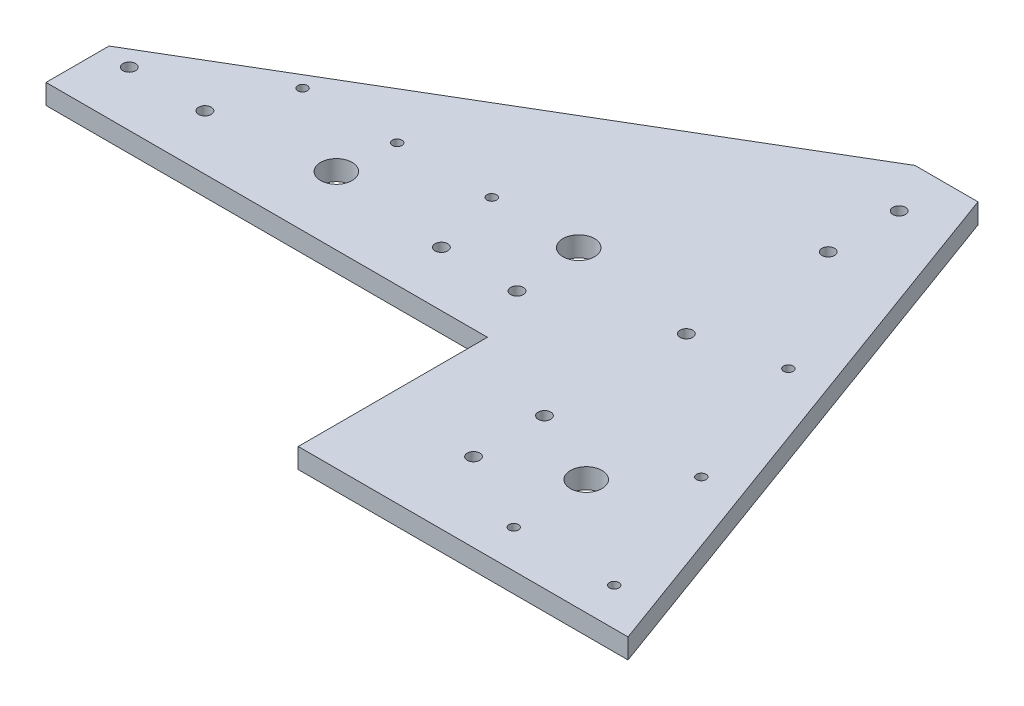
ISO-10303-21;
HEADER;
FILE_DESCRIPTION(('STEP AP214'),'2;1');
FILE_NAME('part.step','',(''),(''),'','','');
FILE_SCHEMA(('AUTOMOTIVE_DESIGN { 1 0 10303 214 1 1 1 1 }'));
ENDSEC;
DATA;
#1=APPLICATION_CONTEXT('core data for automotive mechanical design processes');
#2=APPLICATION_PROTOCOL_DEFINITION('international standard','automotive_design',2000,#1);
#3=PRODUCT_CONTEXT('',#1,'mechanical');
#4=PRODUCT('Part','Part','',(#3));
#5=PRODUCT_RELATED_PRODUCT_CATEGORY('part','',(#4));
#6=PRODUCT_DEFINITION_FORMATION('','',#4);
#7=PRODUCT_DEFINITION_CONTEXT('part definition',#1,'design');
#8=PRODUCT_DEFINITION('design','',#6,#7);
#9=PRODUCT_DEFINITION_SHAPE('','',#8);
#10=(LENGTH_UNIT() NAMED_UNIT(*) SI_UNIT(.MILLI.,.METRE.));
#11=(NAMED_UNIT(*) PLANE_ANGLE_UNIT() SI_UNIT($,.RADIAN.));
#12=(NAMED_UNIT(*) SI_UNIT($,.STERADIAN.) SOLID_ANGLE_UNIT());
#13=UNCERTAINTY_MEASURE_WITH_UNIT(LENGTH_MEASURE(1.E-05),#10,'distance_accuracy_value','');
#14=(GEOMETRIC_REPRESENTATION_CONTEXT(3) GLOBAL_UNCERTAINTY_ASSIGNED_CONTEXT((#13)) GLOBAL_UNIT_ASSIGNED_CONTEXT((#10,
#11,#12)) REPRESENTATION_CONTEXT('',''));
#15=CARTESIAN_POINT('',(0.,0.,0.));
#16=DIRECTION('',(0.,0.,1.));
#17=DIRECTION('',(1.,0.,0.));
#18=AXIS2_PLACEMENT_3D('',#15,#16,#17);
#19=CARTESIAN_POINT('',(0.,6.35,0.));
#20=DIRECTION('',(-1.,0.,0.));
#21=DIRECTION('',(0.,0.,1.));
#22=AXIS2_PLACEMENT_3D('',#19,#20,#21);
#23=PLANE('',#22);
#24=DIRECTION('',(0.,0.,-1.));
#25=VECTOR('',#24,1.);
#26=CARTESIAN_POINT('',(0.,0.,0.));
#27=LINE('',#26,#25);
#28=CARTESIAN_POINT('',(0.,0.,-60.));
#29=VERTEX_POINT('',#28);
#30=CARTESIAN_POINT('',(0.,0.,-80.));
#31=VERTEX_POINT('',#30);
#32=EDGE_CURVE('E134',#29,#31,#27,.T.);
#33=ORIENTED_EDGE('',*,*,#32,.F.);
#34=DIRECTION('',(0.,-1.,0.));
#35=VECTOR('',#34,1.);
#36=CARTESIAN_POINT('',(0.,6.35,-60.));
#37=LINE('',#36,#35);
#38=CARTESIAN_POINT('',(0.,6.35,-60.));
#39=VERTEX_POINT('',#38);
#40=EDGE_CURVE('E11',#39,#29,#37,.T.);
#41=ORIENTED_EDGE('',*,*,#40,.F.);
#42=DIRECTION('',(0.,0.,-1.));
#43=VECTOR('',#42,1.);
#44=CARTESIAN_POINT('',(0.,6.35,0.));
#45=LINE('',#44,#43);
#46=CARTESIAN_POINT('',(0.,6.35,-80.));
#47=VERTEX_POINT('',#46);
#48=EDGE_CURVE('E193',#39,#47,#45,.T.);
#49=ORIENTED_EDGE('',*,*,#48,.T.);
#50=DIRECTION('',(0.,-1.,0.));
#51=VECTOR('',#50,1.);
#52=CARTESIAN_POINT('',(0.,6.35,-80.));
#53=LINE('',#52,#51);
#54=EDGE_CURVE('E84',#47,#31,#53,.T.);
#55=ORIENTED_EDGE('',*,*,#54,.T.);
#56=EDGE_LOOP('',(#33,#41,#49,#55));
#57=FACE_BOUND('',#56,.T.);
#58=ADVANCED_FACE('F34',(#57),#23,.T.);
#59=CARTESIAN_POINT('',(0.,6.35,-60.));
#60=DIRECTION('',(0.,0.,1.));
#61=DIRECTION('',(1.,0.,0.));
#62=AXIS2_PLACEMENT_3D('',#59,#60,#61);
#63=PLANE('',#62);
#64=DIRECTION('',(-1.,0.,0.));
#65=VECTOR('',#64,1.);
#66=CARTESIAN_POINT('',(0.,0.,-60.));
#67=LINE('',#66,#65);
#68=CARTESIAN_POINT('',(140.,0.,-60.));
#69=VERTEX_POINT('',#68);
#70=EDGE_CURVE('E137',#69,#29,#67,.T.);
#71=ORIENTED_EDGE('',*,*,#70,.F.);
#72=DIRECTION('',(0.,-1.,0.));
#73=VECTOR('',#72,1.);
#74=CARTESIAN_POINT('',(140.,6.35,-60.));
#75=LINE('',#74,#73);
#76=CARTESIAN_POINT('',(140.,6.35,-60.));
#77=VERTEX_POINT('',#76);
#78=EDGE_CURVE('E44',#77,#69,#75,.T.);
#79=ORIENTED_EDGE('',*,*,#78,.F.);
#80=DIRECTION('',(-1.,0.,0.));
#81=VECTOR('',#80,1.);
#82=CARTESIAN_POINT('',(0.,6.35,-60.));
#83=LINE('',#82,#81);
#84=EDGE_CURVE('E195',#77,#39,#83,.T.);
#85=ORIENTED_EDGE('',*,*,#84,.T.);
#86=ORIENTED_EDGE('',*,*,#40,.T.);
#87=EDGE_LOOP('',(#71,#79,#85,#86));
#88=FACE_BOUND('',#87,.T.);
#89=ADVANCED_FACE('F211',(#88),#63,.T.);
#90=CARTESIAN_POINT('',(140.,6.35,0.));
#91=DIRECTION('',(1.,0.,0.));
#92=DIRECTION('',(0.,0.,-1.));
#93=AXIS2_PLACEMENT_3D('',#90,#91,#92);
#94=PLANE('',#93);
#95=DIRECTION('',(0.,0.,1.));
#96=VECTOR('',#95,1.);
#97=CARTESIAN_POINT('',(140.,0.,0.));
#98=LINE('',#97,#96);
#99=CARTESIAN_POINT('',(140.,0.,0.));
#100=VERTEX_POINT('',#99);
#101=EDGE_CURVE('E140',#69,#100,#98,.T.);
#102=ORIENTED_EDGE('',*,*,#101,.T.);
#103=DIRECTION('',(0.,-1.,0.));
#104=VECTOR('',#103,1.);
#105=CARTESIAN_POINT('',(140.,6.35,0.));
#106=LINE('',#105,#104);
#107=CARTESIAN_POINT('',(140.,6.35,0.));
#108=VERTEX_POINT('',#107);
#109=EDGE_CURVE('E158',#108,#100,#106,.T.);
#110=ORIENTED_EDGE('',*,*,#109,.F.);
#111=DIRECTION('',(0.,0.,1.));
#112=VECTOR('',#111,1.);
#113=CARTESIAN_POINT('',(140.,6.35,0.));
#114=LINE('',#113,#112);
#115=EDGE_CURVE('E198',#77,#108,#114,.T.);
#116=ORIENTED_EDGE('',*,*,#115,.F.);
#117=ORIENTED_EDGE('',*,*,#78,.T.);
#118=EDGE_LOOP('',(#102,#110,#116,#117));
#119=FACE_BOUND('',#118,.T.);
#120=ADVANCED_FACE('F214',(#119),#94,.F.);
#121=CARTESIAN_POINT('',(0.,6.35,0.));
#122=DIRECTION('',(0.,0.,1.));
#123=DIRECTION('',(1.,0.,0.));
#124=AXIS2_PLACEMENT_3D('',#121,#122,#123);
#125=PLANE('',#124);
#126=DIRECTION('',(-1.,0.,0.));
#127=VECTOR('',#126,1.);
#128=CARTESIAN_POINT('',(0.,0.,0.));
#129=LINE('',#128,#127);
#130=CARTESIAN_POINT('',(244.6,0.,0.));
#131=VERTEX_POINT('',#130);
#132=EDGE_CURVE('E143',#131,#100,#129,.T.);
#133=ORIENTED_EDGE('',*,*,#132,.F.);
#134=DIRECTION('',(0.,-1.,0.));
#135=VECTOR('',#134,1.);
#136=CARTESIAN_POINT('',(244.6,6.35,0.));
#137=LINE('',#136,#135);
#138=CARTESIAN_POINT('',(244.6,6.35,0.));
#139=VERTEX_POINT('',#138);
#140=EDGE_CURVE('E117',#139,#131,#137,.T.);
#141=ORIENTED_EDGE('',*,*,#140,.F.);
#142=DIRECTION('',(-1.,0.,0.));
#143=VECTOR('',#142,1.);
#144=CARTESIAN_POINT('',(0.,6.35,0.));
#145=LINE('',#144,#143);
#146=EDGE_CURVE('E106',#139,#108,#145,.T.);
#147=ORIENTED_EDGE('',*,*,#146,.T.);
#148=ORIENTED_EDGE('',*,*,#109,.T.);
#149=EDGE_LOOP('',(#133,#141,#147,#148));
#150=FACE_BOUND('',#149,.T.);
#151=ADVANCED_FACE('F201',(#150),#125,.T.);
#152=CARTESIAN_POINT('',(215.744794216756,6.35,-78.9009533135567));
#153=DIRECTION('',(-0.93916508000078,0.,0.343466086400285));
#154=DIRECTION('',(0.343466086400286,0.,0.93916508000078));
#155=AXIS2_PLACEMENT_3D('',#152,#153,#154);
#156=PLANE('',#155);
#157=DIRECTION('',(-0.343466086400285,0.,-0.93916508000078));
#158=VECTOR('',#157,1.);
#159=CARTESIAN_POINT('',(215.744794216756,0.,-78.9009533135567));
#160=LINE('',#159,#158);
#161=CARTESIAN_POINT('',(180.6,0.,-175.));
#162=VERTEX_POINT('',#161);
#163=EDGE_CURVE('E113',#131,#162,#160,.T.);
#164=ORIENTED_EDGE('',*,*,#163,.T.);
#165=DIRECTION('',(0.,-1.,0.));
#166=VECTOR('',#165,1.);
#167=CARTESIAN_POINT('',(180.6,6.35,-175.));
#168=LINE('',#167,#166);
#169=CARTESIAN_POINT('',(180.6,6.35,-175.));
#170=VERTEX_POINT('',#169);
#171=EDGE_CURVE('E110',#170,#162,#168,.T.);
#172=ORIENTED_EDGE('',*,*,#171,.F.);
#173=DIRECTION('',(-0.343466086400285,0.,-0.93916508000078));
#174=VECTOR('',#173,1.);
#175=CARTESIAN_POINT('',(215.744794216756,6.35,-78.9009533135567));
#176=LINE('',#175,#174);
#177=EDGE_CURVE('E99',#139,#170,#176,.T.);
#178=ORIENTED_EDGE('',*,*,#177,.F.);
#179=ORIENTED_EDGE('',*,*,#140,.T.);
#180=EDGE_LOOP('',(#164,#172,#178,#179));
#181=FACE_BOUND('',#180,.T.);
#182=ADVANCED_FACE('F111',(#181),#156,.F.);
#183=CARTESIAN_POINT('',(0.,6.35,-175.));
#184=DIRECTION('',(0.,0.,-1.));
#185=DIRECTION('',(-1.,0.,0.));
#186=AXIS2_PLACEMENT_3D('',#183,#184,#185);
#187=PLANE('',#186);
#188=DIRECTION('',(1.,0.,0.));
#189=VECTOR('',#188,1.);
#190=CARTESIAN_POINT('',(0.,0.,-175.));
#191=LINE('',#190,#189);
#192=CARTESIAN_POINT('',(160.6,0.,-175.));
#193=VERTEX_POINT('',#192);
#194=EDGE_CURVE('E147',#193,#162,#191,.T.);
#195=ORIENTED_EDGE('',*,*,#194,.F.);
#196=DIRECTION('',(0.,-1.,0.));
#197=VECTOR('',#196,1.);
#198=CARTESIAN_POINT('',(160.6,6.35,-175.));
#199=LINE('',#198,#197);
#200=CARTESIAN_POINT('',(160.6,6.35,-175.));
#201=VERTEX_POINT('',#200);
#202=EDGE_CURVE('E77',#201,#193,#199,.T.);
#203=ORIENTED_EDGE('',*,*,#202,.F.);
#204=DIRECTION('',(1.,0.,0.));
#205=VECTOR('',#204,1.);
#206=CARTESIAN_POINT('',(0.,6.35,-175.));
#207=LINE('',#206,#205);
#208=EDGE_CURVE('E104',#201,#170,#207,.T.);
#209=ORIENTED_EDGE('',*,*,#208,.T.);
#210=ORIENTED_EDGE('',*,*,#171,.T.);
#211=EDGE_LOOP('',(#195,#203,#209,#210));
#212=FACE_BOUND('',#211,.T.);
#213=ADVANCED_FACE('F119',(#212),#187,.T.);
#214=CARTESIAN_POINT('',(-35.0560754749929,6.35,-59.2632181187775));
#215=DIRECTION('',(0.50912648086235,0.,0.860691713963089));
#216=DIRECTION('',(0.860691713963089,0.,-0.50912648086235));
#217=AXIS2_PLACEMENT_3D('',#214,#215,#216);
#218=PLANE('',#217);
#219=DIRECTION('',(-0.860691713963089,0.,0.50912648086235));
#220=VECTOR('',#219,1.);
#221=CARTESIAN_POINT('',(-35.0560754749929,0.,-59.2632181187775));
#222=LINE('',#221,#220);
#223=EDGE_CURVE('E149',#193,#31,#222,.T.);
#224=ORIENTED_EDGE('',*,*,#223,.T.);
#225=ORIENTED_EDGE('',*,*,#54,.F.);
#226=DIRECTION('',(-0.860691713963089,0.,0.50912648086235));
#227=VECTOR('',#226,1.);
#228=CARTESIAN_POINT('',(-35.0560754749929,6.35,-59.2632181187775));
#229=LINE('',#228,#227);
#230=EDGE_CURVE('E53',#201,#47,#229,.T.);
#231=ORIENTED_EDGE('',*,*,#230,.F.);
#232=ORIENTED_EDGE('',*,*,#202,.T.);
#233=EDGE_LOOP('',(#224,#225,#231,#232));
#234=FACE_BOUND('',#233,.T.);
#235=ADVANCED_FACE('F207',(#234),#218,.F.);
#236=CARTESIAN_POINT('',(70.5,6.35,-81.59));
#237=DIRECTION('',(0.,-1.,0.));
#238=DIRECTION('',(0.,0.,-1.));
#239=AXIS2_PLACEMENT_3D('',#236,#237,#238);
#240=CYLINDRICAL_SURFACE('',#239,5.00000000000001);
#241=CARTESIAN_POINT('',(70.5,6.35,-81.59));
#242=DIRECTION('',(0.,1.,0.));
#243=DIRECTION('',(0.,0.,1.));
#244=AXIS2_PLACEMENT_3D('',#241,#242,#243);
#245=CIRCLE('',#244,5.00000000000001);
#246=CARTESIAN_POINT('',(70.5,6.35,-76.59));
#247=VERTEX_POINT('',#246);
#248=EDGE_CURVE('E190',#247,#247,#245,.T.);
#249=ORIENTED_EDGE('',*,*,#248,.T.);
#250=EDGE_LOOP('',(#249));
#251=FACE_BOUND('',#250,.T.);
#252=CARTESIAN_POINT('',(70.5,0.,-81.59));
#253=DIRECTION('',(0.,1.,0.));
#254=DIRECTION('',(0.,0.,1.));
#255=AXIS2_PLACEMENT_3D('',#252,#253,#254);
#256=CIRCLE('',#255,5.00000000000001);
#257=CARTESIAN_POINT('',(70.5,0.,-76.59));
#258=VERTEX_POINT('',#257);
#259=EDGE_CURVE('E130',#258,#258,#256,.T.);
#260=ORIENTED_EDGE('',*,*,#259,.F.);
#261=EDGE_LOOP('',(#260));
#262=FACE_BOUND('',#261,.T.);
#263=ADVANCED_FACE('F227',(#251,#262),#240,.F.);
#264=CARTESIAN_POINT('',(129.875,6.35,-99.09));
#265=DIRECTION('',(0.,-1.,0.));
#266=DIRECTION('',(0.,0.,-1.));
#267=AXIS2_PLACEMENT_3D('',#264,#265,#266);
#268=CYLINDRICAL_SURFACE('',#267,5.00000000000002);
#269=CARTESIAN_POINT('',(129.875,6.35,-99.09));
#270=DIRECTION('',(0.,1.,0.));
#271=DIRECTION('',(0.,0.,1.));
#272=AXIS2_PLACEMENT_3D('',#269,#270,#271);
#273=CIRCLE('',#272,5.00000000000002);
#274=CARTESIAN_POINT('',(129.875,6.35,-94.0899999999999));
#275=VERTEX_POINT('',#274);
#276=EDGE_CURVE('E154',#275,#275,#273,.T.);
#277=ORIENTED_EDGE('',*,*,#276,.T.);
#278=EDGE_LOOP('',(#277));
#279=FACE_BOUND('',#278,.T.);
#280=CARTESIAN_POINT('',(129.875,0.,-99.09));
#281=DIRECTION('',(0.,1.,0.));
#282=DIRECTION('',(0.,0.,1.));
#283=AXIS2_PLACEMENT_3D('',#280,#281,#282);
#284=CIRCLE('',#283,5.00000000000002);
#285=CARTESIAN_POINT('',(129.875,0.,-94.0899999999999));
#286=VERTEX_POINT('',#285);
#287=EDGE_CURVE('E127',#286,#286,#284,.T.);
#288=ORIENTED_EDGE('',*,*,#287,.F.);
#289=EDGE_LOOP('',(#288));
#290=FACE_BOUND('',#289,.T.);
#291=ADVANCED_FACE('F36',(#279,#290),#268,.F.);
#292=CARTESIAN_POINT('',(194.75,6.35,-36.59));
#293=DIRECTION('',(0.,-1.,0.));
#294=DIRECTION('',(0.,0.,-1.));
#295=AXIS2_PLACEMENT_3D('',#292,#293,#294);
#296=CYLINDRICAL_SURFACE('',#295,4.99999999999999);
#297=CARTESIAN_POINT('',(194.75,6.35,-36.59));
#298=DIRECTION('',(0.,1.,0.));
#299=DIRECTION('',(0.,0.,1.));
#300=AXIS2_PLACEMENT_3D('',#297,#298,#299);
#301=CIRCLE('',#300,4.99999999999999);
#302=CARTESIAN_POINT('',(194.75,6.35,-31.59));
#303=VERTEX_POINT('',#302);
#304=EDGE_CURVE('E121',#303,#303,#301,.T.);
#305=ORIENTED_EDGE('',*,*,#304,.T.);
#306=EDGE_LOOP('',(#305));
#307=FACE_BOUND('',#306,.T.);
#308=CARTESIAN_POINT('',(194.75,0.,-36.59));
#309=DIRECTION('',(0.,1.,0.));
#310=DIRECTION('',(0.,0.,1.));
#311=AXIS2_PLACEMENT_3D('',#308,#309,#310);
#312=CIRCLE('',#311,4.99999999999999);
#313=CARTESIAN_POINT('',(194.75,0.,-31.59));
#314=VERTEX_POINT('',#313);
#315=EDGE_CURVE('E151',#314,#314,#312,.T.);
#316=ORIENTED_EDGE('',*,*,#315,.F.);
#317=EDGE_LOOP('',(#316));
#318=FACE_BOUND('',#317,.T.);
#319=ADVANCED_FACE('F234',(#307,#318),#296,.F.);
#320=CARTESIAN_POINT('',(0.,6.35,0.));
#321=DIRECTION('',(0.,1.,0.));
#322=DIRECTION('',(0.,0.,1.));
#323=AXIS2_PLACEMENT_3D('',#320,#321,#322);
#324=PLANE('',#323);
#325=CARTESIAN_POINT('',(132.000000000004,6.35,-77.4000000000121));
#326=DIRECTION('',(0.,-1.,0.));
#327=DIRECTION('',(0.,0.,-1.));
#328=AXIS2_PLACEMENT_3D('',#325,#326,#327);
#329=CIRCLE('',#328,2.00000000000002);
#330=CARTESIAN_POINT('',(132.000000000004,6.35,-79.4000000000121));
#331=VERTEX_POINT('',#330);
#332=EDGE_CURVE('E499',#331,#331,#329,.T.);
#333=ORIENTED_EDGE('',*,*,#332,.T.);
#334=EDGE_LOOP('',(#333));
#335=FACE_BOUND('',#334,.T.);
#336=CARTESIAN_POINT('',(108.000000000004,6.35,-77.4000000000121));
#337=DIRECTION('',(0.,-1.,0.));
#338=DIRECTION('',(0.,0.,-1.));
#339=AXIS2_PLACEMENT_3D('',#336,#337,#338);
#340=CIRCLE('',#339,2.);
#341=CARTESIAN_POINT('',(108.000000000004,6.35,-79.4000000000121));
#342=VERTEX_POINT('',#341);
#343=EDGE_CURVE('E502',#342,#342,#340,.T.);
#344=ORIENTED_EDGE('',*,*,#343,.T.);
#345=EDGE_LOOP('',(#344));
#346=FACE_BOUND('',#345,.T.);
#347=CARTESIAN_POINT('',(9.00000000000389,6.35,-77.4000000000117));
#348=DIRECTION('',(0.,-1.,0.));
#349=DIRECTION('',(0.,0.,-1.));
#350=AXIS2_PLACEMENT_3D('',#347,#348,#349);
#351=CIRCLE('',#350,2.00000000000001);
#352=CARTESIAN_POINT('',(9.00000000000389,6.35,-79.4000000000117));
#353=VERTEX_POINT('',#352);
#354=EDGE_CURVE('E626',#353,#353,#351,.T.);
#355=ORIENTED_EDGE('',*,*,#354,.T.);
#356=EDGE_LOOP('',(#355));
#357=FACE_BOUND('',#356,.T.);
#358=CARTESIAN_POINT('',(33.0000000000042,6.35,-77.4000000000121));
#359=DIRECTION('',(0.,-1.,0.));
#360=DIRECTION('',(0.,0.,-1.));
#361=AXIS2_PLACEMENT_3D('',#358,#359,#360);
#362=CIRCLE('',#361,2.00000000000001);
#363=CARTESIAN_POINT('',(33.0000000000042,6.35,-79.4000000000121));
#364=VERTEX_POINT('',#363);
#365=EDGE_CURVE('E510',#364,#364,#362,.T.);
#366=ORIENTED_EDGE('',*,*,#365,.T.);
#367=EDGE_LOOP('',(#366));
#368=FACE_BOUND('',#367,.T.);
#369=CARTESIAN_POINT('',(170.6,6.35,-160.));
#370=DIRECTION('',(0.,1.,0.));
#371=DIRECTION('',(0.,0.,1.));
#372=AXIS2_PLACEMENT_3D('',#369,#370,#371);
#373=CIRCLE('',#372,2.);
#374=CARTESIAN_POINT('',(170.6,6.35,-158.));
#375=VERTEX_POINT('',#374);
#376=EDGE_CURVE('E165',#375,#375,#373,.T.);
#377=ORIENTED_EDGE('',*,*,#376,.F.);
#378=EDGE_LOOP('',(#377));
#379=FACE_BOUND('',#378,.T.);
#380=CARTESIAN_POINT('',(170.6,6.35,-137.5));
#381=DIRECTION('',(0.,1.,0.));
#382=DIRECTION('',(0.,0.,1.));
#383=AXIS2_PLACEMENT_3D('',#380,#381,#382);
#384=CIRCLE('',#383,1.99999999999979);
#385=CARTESIAN_POINT('',(170.6,6.35,-135.5));
#386=VERTEX_POINT('',#385);
#387=EDGE_CURVE('E520',#386,#386,#384,.T.);
#388=ORIENTED_EDGE('',*,*,#387,.F.);
#389=EDGE_LOOP('',(#388));
#390=FACE_BOUND('',#389,.T.);
#391=CARTESIAN_POINT('',(170.6,6.35,-92.5));
#392=DIRECTION('',(0.,1.,0.));
#393=DIRECTION('',(0.,0.,1.));
#394=AXIS2_PLACEMENT_3D('',#391,#392,#393);
#395=CIRCLE('',#394,2.);
#396=CARTESIAN_POINT('',(170.6,6.35,-90.5));
#397=VERTEX_POINT('',#396);
#398=EDGE_CURVE('E523',#397,#397,#395,.T.);
#399=ORIENTED_EDGE('',*,*,#398,.F.);
#400=EDGE_LOOP('',(#399));
#401=FACE_BOUND('',#400,.T.);
#402=CARTESIAN_POINT('',(170.6,6.35,-47.5));
#403=DIRECTION('',(0.,1.,0.));
#404=DIRECTION('',(0.,0.,1.));
#405=AXIS2_PLACEMENT_3D('',#402,#403,#404);
#406=CIRCLE('',#405,2.);
#407=CARTESIAN_POINT('',(170.6,6.35,-45.5));
#408=VERTEX_POINT('',#407);
#409=EDGE_CURVE('E526',#408,#408,#406,.T.);
#410=ORIENTED_EDGE('',*,*,#409,.F.);
#411=EDGE_LOOP('',(#410));
#412=FACE_BOUND('',#411,.T.);
#413=CARTESIAN_POINT('',(170.6,6.35,-25.));
#414=DIRECTION('',(0.,1.,0.));
#415=DIRECTION('',(0.,0.,1.));
#416=AXIS2_PLACEMENT_3D('',#413,#414,#415);
#417=CIRCLE('',#416,2.);
#418=CARTESIAN_POINT('',(170.6,6.35,-23.));
#419=VERTEX_POINT('',#418);
#420=EDGE_CURVE('E513',#419,#419,#417,.T.);
#421=ORIENTED_EDGE('',*,*,#420,.F.);
#422=EDGE_LOOP('',(#421));
#423=FACE_BOUND('',#422,.T.);
#424=CARTESIAN_POINT('',(42.2795875099789,6.35,-99.09440108));
#425=DIRECTION('',(0.,1.,0.));
#426=DIRECTION('',(0.,0.,1.));
#427=AXIS2_PLACEMENT_3D('',#424,#425,#426);
#428=CIRCLE('',#427,1.5);
#429=CARTESIAN_POINT('',(42.2795875099789,6.35,-97.59440108));
#430=VERTEX_POINT('',#429);
#431=EDGE_CURVE('E533',#430,#430,#428,.T.);
#432=ORIENTED_EDGE('',*,*,#431,.F.);
#433=EDGE_LOOP('',(#432));
#434=FACE_BOUND('',#433,.T.);
#435=CARTESIAN_POINT('',(72.279587509979,6.35,-99.09440108));
#436=DIRECTION('',(0.,1.,0.));
#437=DIRECTION('',(0.,0.,1.));
#438=AXIS2_PLACEMENT_3D('',#435,#436,#437);
#439=CIRCLE('',#438,1.5);
#440=CARTESIAN_POINT('',(72.279587509979,6.35,-97.59440108));
#441=VERTEX_POINT('',#440);
#442=EDGE_CURVE('E536',#441,#441,#439,.T.);
#443=ORIENTED_EDGE('',*,*,#442,.F.);
#444=EDGE_LOOP('',(#443));
#445=FACE_BOUND('',#444,.T.);
#446=CARTESIAN_POINT('',(102.279587509979,6.35,-99.09440108));
#447=DIRECTION('',(0.,1.,0.));
#448=DIRECTION('',(0.,0.,1.));
#449=AXIS2_PLACEMENT_3D('',#446,#447,#448);
#450=CIRCLE('',#449,1.5);
#451=CARTESIAN_POINT('',(102.279587509979,6.35,-97.59440108));
#452=VERTEX_POINT('',#451);
#453=EDGE_CURVE('E542',#452,#452,#450,.T.);
#454=ORIENTED_EDGE('',*,*,#453,.F.);
#455=EDGE_LOOP('',(#454));
#456=FACE_BOUND('',#455,.T.);
#457=CARTESIAN_POINT('',(196.359761890743,6.35,-99.09440108));
#458=DIRECTION('',(0.,1.,0.));
#459=DIRECTION('',(0.,0.,1.));
#460=AXIS2_PLACEMENT_3D('',#457,#458,#459);
#461=CIRCLE('',#460,1.5);
#462=CARTESIAN_POINT('',(196.359761890743,6.35,-97.59440108));
#463=VERTEX_POINT('',#462);
#464=EDGE_CURVE('E548',#463,#463,#461,.T.);
#465=ORIENTED_EDGE('',*,*,#464,.F.);
#466=EDGE_LOOP('',(#465));
#467=FACE_BOUND('',#466,.T.);
#468=CARTESIAN_POINT('',(212.285595231086,6.35,-55.54720054));
#469=DIRECTION('',(0.,1.,0.));
#470=DIRECTION('',(0.,0.,1.));
#471=AXIS2_PLACEMENT_3D('',#468,#469,#470);
#472=CIRCLE('',#471,1.5);
#473=CARTESIAN_POINT('',(212.285595231086,6.35,-54.04720054));
#474=VERTEX_POINT('',#473);
#475=EDGE_CURVE('E554',#474,#474,#472,.T.);
#476=ORIENTED_EDGE('',*,*,#475,.F.);
#477=EDGE_LOOP('',(#476));
#478=FACE_BOUND('',#477,.T.);
#479=CARTESIAN_POINT('',(228.211428571429,6.35,-12.));
#480=DIRECTION('',(0.,1.,0.));
#481=DIRECTION('',(0.,0.,1.));
#482=AXIS2_PLACEMENT_3D('',#479,#480,#481);
#483=CIRCLE('',#482,1.5);
#484=CARTESIAN_POINT('',(228.211428571429,6.35,-10.5));
#485=VERTEX_POINT('',#484);
#486=EDGE_CURVE('E560',#485,#485,#483,.T.);
#487=ORIENTED_EDGE('',*,*,#486,.F.);
#488=EDGE_LOOP('',(#487));
#489=FACE_BOUND('',#488,.T.);
#490=CARTESIAN_POINT('',(196.359761890743,6.35,-12.));
#491=DIRECTION('',(0.,1.,0.));
#492=DIRECTION('',(0.,0.,1.));
#493=AXIS2_PLACEMENT_3D('',#490,#491,#492);
#494=CIRCLE('',#493,1.5);
#495=CARTESIAN_POINT('',(196.359761890743,6.35,-10.5));
#496=VERTEX_POINT('',#495);
#497=EDGE_CURVE('E179',#496,#496,#494,.T.);
#498=ORIENTED_EDGE('',*,*,#497,.F.);
#499=EDGE_LOOP('',(#498));
#500=FACE_BOUND('',#499,.T.);
#501=ORIENTED_EDGE('',*,*,#276,.F.);
#502=EDGE_LOOP('',(#501));
#503=FACE_BOUND('',#502,.T.);
#504=ORIENTED_EDGE('',*,*,#248,.F.);
#505=EDGE_LOOP('',(#504));
#506=FACE_BOUND('',#505,.T.);
#507=ORIENTED_EDGE('',*,*,#48,.F.);
#508=ORIENTED_EDGE('',*,*,#84,.F.);
#509=ORIENTED_EDGE('',*,*,#115,.T.);
#510=ORIENTED_EDGE('',*,*,#146,.F.);
#511=ORIENTED_EDGE('',*,*,#177,.T.);
#512=ORIENTED_EDGE('',*,*,#208,.F.);
#513=ORIENTED_EDGE('',*,*,#230,.T.);
#514=EDGE_LOOP('',(#507,#508,#509,#510,#511,#512,#513));
#515=FACE_BOUND('',#514,.T.);
#516=ORIENTED_EDGE('',*,*,#304,.F.);
#517=EDGE_LOOP('',(#516));
#518=FACE_BOUND('',#517,.T.);
#519=ADVANCED_FACE('F101',(#335,#346,#357,#368,#379,#390,#401,#412,#423,#434,#445,#456,#467,
#478,#489,#500,#503,#506,#515,#518),#324,.T.);
#520=CARTESIAN_POINT('',(0.,0.,0.));
#521=DIRECTION('',(0.,1.,0.));
#522=DIRECTION('',(0.,0.,1.));
#523=AXIS2_PLACEMENT_3D('',#520,#521,#522);
#524=PLANE('',#523);
#525=CARTESIAN_POINT('',(132.000000000004,0.,-77.4000000000121));
#526=DIRECTION('',(0.,-1.,0.));
#527=DIRECTION('',(0.,0.,-1.));
#528=AXIS2_PLACEMENT_3D('',#525,#526,#527);
#529=CIRCLE('',#528,2.00000000000002);
#530=CARTESIAN_POINT('',(132.000000000004,0.,-79.4000000000121));
#531=VERTEX_POINT('',#530);
#532=EDGE_CURVE('E501',#531,#531,#529,.T.);
#533=ORIENTED_EDGE('',*,*,#532,.F.);
#534=EDGE_LOOP('',(#533));
#535=FACE_BOUND('',#534,.T.);
#536=CARTESIAN_POINT('',(108.000000000004,0.,-77.4000000000121));
#537=DIRECTION('',(0.,-1.,0.));
#538=DIRECTION('',(0.,0.,-1.));
#539=AXIS2_PLACEMENT_3D('',#536,#537,#538);
#540=CIRCLE('',#539,2.);
#541=CARTESIAN_POINT('',(108.000000000004,0.,-79.4000000000121));
#542=VERTEX_POINT('',#541);
#543=EDGE_CURVE('E505',#542,#542,#540,.T.);
#544=ORIENTED_EDGE('',*,*,#543,.F.);
#545=EDGE_LOOP('',(#544));
#546=FACE_BOUND('',#545,.T.);
#547=CARTESIAN_POINT('',(9.00000000000389,0.,-77.4000000000117));
#548=DIRECTION('',(0.,-1.,0.));
#549=DIRECTION('',(0.,0.,-1.));
#550=AXIS2_PLACEMENT_3D('',#547,#548,#549);
#551=CIRCLE('',#550,2.00000000000001);
#552=CARTESIAN_POINT('',(9.00000000000389,0.,-79.4000000000117));
#553=VERTEX_POINT('',#552);
#554=EDGE_CURVE('E517',#553,#553,#551,.T.);
#555=ORIENTED_EDGE('',*,*,#554,.F.);
#556=EDGE_LOOP('',(#555));
#557=FACE_BOUND('',#556,.T.);
#558=CARTESIAN_POINT('',(33.0000000000042,0.,-77.4000000000121));
#559=DIRECTION('',(0.,-1.,0.));
#560=DIRECTION('',(0.,0.,-1.));
#561=AXIS2_PLACEMENT_3D('',#558,#559,#560);
#562=CIRCLE('',#561,2.00000000000001);
#563=CARTESIAN_POINT('',(33.0000000000042,0.,-79.4000000000121));
#564=VERTEX_POINT('',#563);
#565=EDGE_CURVE('E514',#564,#564,#562,.T.);
#566=ORIENTED_EDGE('',*,*,#565,.F.);
#567=EDGE_LOOP('',(#566));
#568=FACE_BOUND('',#567,.T.);
#569=CARTESIAN_POINT('',(170.6,0.,-160.));
#570=DIRECTION('',(0.,1.,0.));
#571=DIRECTION('',(0.,0.,1.));
#572=AXIS2_PLACEMENT_3D('',#569,#570,#571);
#573=CIRCLE('',#572,2.);
#574=CARTESIAN_POINT('',(170.6,0.,-158.));
#575=VERTEX_POINT('',#574);
#576=EDGE_CURVE('E38',#575,#575,#573,.T.);
#577=ORIENTED_EDGE('',*,*,#576,.T.);
#578=EDGE_LOOP('',(#577));
#579=FACE_BOUND('',#578,.T.);
#580=CARTESIAN_POINT('',(170.6,0.,-137.5));
#581=DIRECTION('',(0.,1.,0.));
#582=DIRECTION('',(0.,0.,1.));
#583=AXIS2_PLACEMENT_3D('',#580,#581,#582);
#584=CIRCLE('',#583,1.99999999999979);
#585=CARTESIAN_POINT('',(170.6,0.,-135.5));
#586=VERTEX_POINT('',#585);
#587=EDGE_CURVE('E170',#586,#586,#584,.T.);
#588=ORIENTED_EDGE('',*,*,#587,.T.);
#589=EDGE_LOOP('',(#588));
#590=FACE_BOUND('',#589,.T.);
#591=CARTESIAN_POINT('',(170.6,0.,-92.5));
#592=DIRECTION('',(0.,1.,0.));
#593=DIRECTION('',(0.,0.,1.));
#594=AXIS2_PLACEMENT_3D('',#591,#592,#593);
#595=CIRCLE('',#594,2.);
#596=CARTESIAN_POINT('',(170.6,0.,-90.5));
#597=VERTEX_POINT('',#596);
#598=EDGE_CURVE('E168',#597,#597,#595,.T.);
#599=ORIENTED_EDGE('',*,*,#598,.T.);
#600=EDGE_LOOP('',(#599));
#601=FACE_BOUND('',#600,.T.);
#602=CARTESIAN_POINT('',(170.6,0.,-47.5));
#603=DIRECTION('',(0.,1.,0.));
#604=DIRECTION('',(0.,0.,1.));
#605=AXIS2_PLACEMENT_3D('',#602,#603,#604);
#606=CIRCLE('',#605,2.);
#607=CARTESIAN_POINT('',(170.6,0.,-45.5));
#608=VERTEX_POINT('',#607);
#609=EDGE_CURVE('E164',#608,#608,#606,.T.);
#610=ORIENTED_EDGE('',*,*,#609,.T.);
#611=EDGE_LOOP('',(#610));
#612=FACE_BOUND('',#611,.T.);
#613=CARTESIAN_POINT('',(170.6,0.,-25.));
#614=DIRECTION('',(0.,1.,0.));
#615=DIRECTION('',(0.,0.,1.));
#616=AXIS2_PLACEMENT_3D('',#613,#614,#615);
#617=CIRCLE('',#616,2.);
#618=CARTESIAN_POINT('',(170.6,0.,-23.));
#619=VERTEX_POINT('',#618);
#620=EDGE_CURVE('E161',#619,#619,#617,.T.);
#621=ORIENTED_EDGE('',*,*,#620,.T.);
#622=EDGE_LOOP('',(#621));
#623=FACE_BOUND('',#622,.T.);
#624=CARTESIAN_POINT('',(42.2795875099789,0.,-99.09440108));
#625=DIRECTION('',(0.,1.,0.));
#626=DIRECTION('',(0.,0.,1.));
#627=AXIS2_PLACEMENT_3D('',#624,#625,#626);
#628=CIRCLE('',#627,1.5);
#629=CARTESIAN_POINT('',(42.2795875099789,0.,-97.59440108));
#630=VERTEX_POINT('',#629);
#631=EDGE_CURVE('E131',#630,#630,#628,.T.);
#632=ORIENTED_EDGE('',*,*,#631,.T.);
#633=EDGE_LOOP('',(#632));
#634=FACE_BOUND('',#633,.T.);
#635=CARTESIAN_POINT('',(72.279587509979,0.,-99.09440108));
#636=DIRECTION('',(0.,1.,0.));
#637=DIRECTION('',(0.,0.,1.));
#638=AXIS2_PLACEMENT_3D('',#635,#636,#637);
#639=CIRCLE('',#638,1.5);
#640=CARTESIAN_POINT('',(72.279587509979,0.,-97.59440108));
#641=VERTEX_POINT('',#640);
#642=EDGE_CURVE('E539',#641,#641,#639,.T.);
#643=ORIENTED_EDGE('',*,*,#642,.T.);
#644=EDGE_LOOP('',(#643));
#645=FACE_BOUND('',#644,.T.);
#646=CARTESIAN_POINT('',(102.279587509979,0.,-99.09440108));
#647=DIRECTION('',(0.,1.,0.));
#648=DIRECTION('',(0.,0.,1.));
#649=AXIS2_PLACEMENT_3D('',#646,#647,#648);
#650=CIRCLE('',#649,1.5);
#651=CARTESIAN_POINT('',(102.279587509979,0.,-97.59440108));
#652=VERTEX_POINT('',#651);
#653=EDGE_CURVE('E545',#652,#652,#650,.T.);
#654=ORIENTED_EDGE('',*,*,#653,.T.);
#655=EDGE_LOOP('',(#654));
#656=FACE_BOUND('',#655,.T.);
#657=CARTESIAN_POINT('',(196.359761890743,0.,-99.09440108));
#658=DIRECTION('',(0.,1.,0.));
#659=DIRECTION('',(0.,0.,1.));
#660=AXIS2_PLACEMENT_3D('',#657,#658,#659);
#661=CIRCLE('',#660,1.5);
#662=CARTESIAN_POINT('',(196.359761890743,0.,-97.59440108));
#663=VERTEX_POINT('',#662);
#664=EDGE_CURVE('E551',#663,#663,#661,.T.);
#665=ORIENTED_EDGE('',*,*,#664,.T.);
#666=EDGE_LOOP('',(#665));
#667=FACE_BOUND('',#666,.T.);
#668=CARTESIAN_POINT('',(212.285595231086,0.,-55.54720054));
#669=DIRECTION('',(0.,1.,0.));
#670=DIRECTION('',(0.,0.,1.));
#671=AXIS2_PLACEMENT_3D('',#668,#669,#670);
#672=CIRCLE('',#671,1.5);
#673=CARTESIAN_POINT('',(212.285595231086,0.,-54.04720054));
#674=VERTEX_POINT('',#673);
#675=EDGE_CURVE('E557',#674,#674,#672,.T.);
#676=ORIENTED_EDGE('',*,*,#675,.T.);
#677=EDGE_LOOP('',(#676));
#678=FACE_BOUND('',#677,.T.);
#679=CARTESIAN_POINT('',(228.211428571429,0.,-12.));
#680=DIRECTION('',(0.,1.,0.));
#681=DIRECTION('',(0.,0.,1.));
#682=AXIS2_PLACEMENT_3D('',#679,#680,#681);
#683=CIRCLE('',#682,1.5);
#684=CARTESIAN_POINT('',(228.211428571429,0.,-10.5));
#685=VERTEX_POINT('',#684);
#686=EDGE_CURVE('E184',#685,#685,#683,.T.);
#687=ORIENTED_EDGE('',*,*,#686,.T.);
#688=EDGE_LOOP('',(#687));
#689=FACE_BOUND('',#688,.T.);
#690=CARTESIAN_POINT('',(196.359761890743,0.,-12.));
#691=DIRECTION('',(0.,1.,0.));
#692=DIRECTION('',(0.,0.,1.));
#693=AXIS2_PLACEMENT_3D('',#690,#691,#692);
#694=CIRCLE('',#693,1.5);
#695=CARTESIAN_POINT('',(196.359761890743,0.,-10.5));
#696=VERTEX_POINT('',#695);
#697=EDGE_CURVE('E175',#696,#696,#694,.T.);
#698=ORIENTED_EDGE('',*,*,#697,.T.);
#699=EDGE_LOOP('',(#698));
#700=FACE_BOUND('',#699,.T.);
#701=ORIENTED_EDGE('',*,*,#287,.T.);
#702=EDGE_LOOP('',(#701));
#703=FACE_BOUND('',#702,.T.);
#704=ORIENTED_EDGE('',*,*,#259,.T.);
#705=EDGE_LOOP('',(#704));
#706=FACE_BOUND('',#705,.T.);
#707=ORIENTED_EDGE('',*,*,#32,.T.);
#708=ORIENTED_EDGE('',*,*,#223,.F.);
#709=ORIENTED_EDGE('',*,*,#194,.T.);
#710=ORIENTED_EDGE('',*,*,#163,.F.);
#711=ORIENTED_EDGE('',*,*,#132,.T.);
#712=ORIENTED_EDGE('',*,*,#101,.F.);
#713=ORIENTED_EDGE('',*,*,#70,.T.);
#714=EDGE_LOOP('',(#707,#708,#709,#710,#711,#712,#713));
#715=FACE_BOUND('',#714,.T.);
#716=ORIENTED_EDGE('',*,*,#315,.T.);
#717=EDGE_LOOP('',(#716));
#718=FACE_BOUND('',#717,.T.);
#719=ADVANCED_FACE('F204',(#535,#546,#557,#568,#579,#590,#601,#612,#623,#634,#645,#656,#667,
#678,#689,#700,#703,#706,#715,#718),#524,.F.);
#720=CARTESIAN_POINT('',(196.359761890743,0.,-12.));
#721=DIRECTION('',(0.,1.,0.));
#722=DIRECTION('',(0.,0.,1.));
#723=AXIS2_PLACEMENT_3D('',#720,#721,#722);
#724=CYLINDRICAL_SURFACE('',#723,1.5);
#725=ORIENTED_EDGE('',*,*,#697,.F.);
#726=EDGE_LOOP('',(#725));
#727=FACE_BOUND('',#726,.T.);
#728=ORIENTED_EDGE('',*,*,#497,.T.);
#729=EDGE_LOOP('',(#728));
#730=FACE_BOUND('',#729,.T.);
#731=ADVANCED_FACE('F242',(#727,#730),#724,.F.);
#732=CARTESIAN_POINT('',(228.211428571429,0.,-12.));
#733=DIRECTION('',(0.,1.,0.));
#734=DIRECTION('',(0.,0.,1.));
#735=AXIS2_PLACEMENT_3D('',#732,#733,#734);
#736=CYLINDRICAL_SURFACE('',#735,1.5);
#737=ORIENTED_EDGE('',*,*,#686,.F.);
#738=EDGE_LOOP('',(#737));
#739=FACE_BOUND('',#738,.T.);
#740=ORIENTED_EDGE('',*,*,#486,.T.);
#741=EDGE_LOOP('',(#740));
#742=FACE_BOUND('',#741,.T.);
#743=ADVANCED_FACE('F250',(#739,#742),#736,.F.);
#744=CARTESIAN_POINT('',(212.285595231086,0.,-55.54720054));
#745=DIRECTION('',(0.,1.,0.));
#746=DIRECTION('',(0.,0.,1.));
#747=AXIS2_PLACEMENT_3D('',#744,#745,#746);
#748=CYLINDRICAL_SURFACE('',#747,1.5);
#749=ORIENTED_EDGE('',*,*,#675,.F.);
#750=EDGE_LOOP('',(#749));
#751=FACE_BOUND('',#750,.T.);
#752=ORIENTED_EDGE('',*,*,#475,.T.);
#753=EDGE_LOOP('',(#752));
#754=FACE_BOUND('',#753,.T.);
#755=ADVANCED_FACE('F310',(#751,#754),#748,.F.);
#756=CARTESIAN_POINT('',(196.359761890743,0.,-99.09440108));
#757=DIRECTION('',(0.,1.,0.));
#758=DIRECTION('',(0.,0.,1.));
#759=AXIS2_PLACEMENT_3D('',#756,#757,#758);
#760=CYLINDRICAL_SURFACE('',#759,1.5);
#761=ORIENTED_EDGE('',*,*,#664,.F.);
#762=EDGE_LOOP('',(#761));
#763=FACE_BOUND('',#762,.T.);
#764=ORIENTED_EDGE('',*,*,#464,.T.);
#765=EDGE_LOOP('',(#764));
#766=FACE_BOUND('',#765,.T.);
#767=ADVANCED_FACE('F320',(#763,#766),#760,.F.);
#768=CARTESIAN_POINT('',(102.279587509979,0.,-99.09440108));
#769=DIRECTION('',(0.,1.,0.));
#770=DIRECTION('',(0.,0.,1.));
#771=AXIS2_PLACEMENT_3D('',#768,#769,#770);
#772=CYLINDRICAL_SURFACE('',#771,1.5);
#773=ORIENTED_EDGE('',*,*,#653,.F.);
#774=EDGE_LOOP('',(#773));
#775=FACE_BOUND('',#774,.T.);
#776=ORIENTED_EDGE('',*,*,#453,.T.);
#777=EDGE_LOOP('',(#776));
#778=FACE_BOUND('',#777,.T.);
#779=ADVANCED_FACE('F330',(#775,#778),#772,.F.);
#780=CARTESIAN_POINT('',(72.279587509979,0.,-99.09440108));
#781=DIRECTION('',(0.,1.,0.));
#782=DIRECTION('',(0.,0.,1.));
#783=AXIS2_PLACEMENT_3D('',#780,#781,#782);
#784=CYLINDRICAL_SURFACE('',#783,1.5);
#785=ORIENTED_EDGE('',*,*,#642,.F.);
#786=EDGE_LOOP('',(#785));
#787=FACE_BOUND('',#786,.T.);
#788=ORIENTED_EDGE('',*,*,#442,.T.);
#789=EDGE_LOOP('',(#788));
#790=FACE_BOUND('',#789,.T.);
#791=ADVANCED_FACE('F340',(#787,#790),#784,.F.);
#792=CARTESIAN_POINT('',(42.2795875099789,0.,-99.09440108));
#793=DIRECTION('',(0.,1.,0.));
#794=DIRECTION('',(0.,0.,1.));
#795=AXIS2_PLACEMENT_3D('',#792,#793,#794);
#796=CYLINDRICAL_SURFACE('',#795,1.5);
#797=ORIENTED_EDGE('',*,*,#631,.F.);
#798=EDGE_LOOP('',(#797));
#799=FACE_BOUND('',#798,.T.);
#800=ORIENTED_EDGE('',*,*,#431,.T.);
#801=EDGE_LOOP('',(#800));
#802=FACE_BOUND('',#801,.T.);
#803=ADVANCED_FACE('F350',(#799,#802),#796,.F.);
#804=CARTESIAN_POINT('',(170.6,-3.65,-25.));
#805=DIRECTION('',(0.,1.,0.));
#806=DIRECTION('',(0.,0.,1.));
#807=AXIS2_PLACEMENT_3D('',#804,#805,#806);
#808=CYLINDRICAL_SURFACE('',#807,2.);
#809=ORIENTED_EDGE('',*,*,#420,.T.);
#810=EDGE_LOOP('',(#809));
#811=FACE_BOUND('',#810,.T.);
#812=ORIENTED_EDGE('',*,*,#620,.F.);
#813=EDGE_LOOP('',(#812));
#814=FACE_BOUND('',#813,.T.);
#815=ADVANCED_FACE('F360',(#811,#814),#808,.F.);
#816=CARTESIAN_POINT('',(170.6,-3.65,-47.5));
#817=DIRECTION('',(0.,1.,0.));
#818=DIRECTION('',(0.,0.,1.));
#819=AXIS2_PLACEMENT_3D('',#816,#817,#818);
#820=CYLINDRICAL_SURFACE('',#819,2.);
#821=ORIENTED_EDGE('',*,*,#409,.T.);
#822=EDGE_LOOP('',(#821));
#823=FACE_BOUND('',#822,.T.);
#824=ORIENTED_EDGE('',*,*,#609,.F.);
#825=EDGE_LOOP('',(#824));
#826=FACE_BOUND('',#825,.T.);
#827=ADVANCED_FACE('F370',(#823,#826),#820,.F.);
#828=CARTESIAN_POINT('',(170.6,-3.65,-92.5));
#829=DIRECTION('',(0.,1.,0.));
#830=DIRECTION('',(0.,0.,1.));
#831=AXIS2_PLACEMENT_3D('',#828,#829,#830);
#832=CYLINDRICAL_SURFACE('',#831,2.);
#833=ORIENTED_EDGE('',*,*,#398,.T.);
#834=EDGE_LOOP('',(#833));
#835=FACE_BOUND('',#834,.T.);
#836=ORIENTED_EDGE('',*,*,#598,.F.);
#837=EDGE_LOOP('',(#836));
#838=FACE_BOUND('',#837,.T.);
#839=ADVANCED_FACE('F380',(#835,#838),#832,.F.);
#840=CARTESIAN_POINT('',(170.6,-3.65,-137.5));
#841=DIRECTION('',(0.,1.,0.));
#842=DIRECTION('',(0.,0.,1.));
#843=AXIS2_PLACEMENT_3D('',#840,#841,#842);
#844=CYLINDRICAL_SURFACE('',#843,1.99999999999979);
#845=ORIENTED_EDGE('',*,*,#387,.T.);
#846=EDGE_LOOP('',(#845));
#847=FACE_BOUND('',#846,.T.);
#848=ORIENTED_EDGE('',*,*,#587,.F.);
#849=EDGE_LOOP('',(#848));
#850=FACE_BOUND('',#849,.T.);
#851=ADVANCED_FACE('F390',(#847,#850),#844,.F.);
#852=CARTESIAN_POINT('',(170.6,-3.65,-160.));
#853=DIRECTION('',(0.,1.,0.));
#854=DIRECTION('',(0.,0.,1.));
#855=AXIS2_PLACEMENT_3D('',#852,#853,#854);
#856=CYLINDRICAL_SURFACE('',#855,2.);
#857=ORIENTED_EDGE('',*,*,#376,.T.);
#858=EDGE_LOOP('',(#857));
#859=FACE_BOUND('',#858,.T.);
#860=ORIENTED_EDGE('',*,*,#576,.F.);
#861=EDGE_LOOP('',(#860));
#862=FACE_BOUND('',#861,.T.);
#863=ADVANCED_FACE('F400',(#859,#862),#856,.F.);
#864=CARTESIAN_POINT('',(33.0000000000042,6.35,-77.4000000000121));
#865=DIRECTION('',(0.,-1.,0.));
#866=DIRECTION('',(0.,0.,-1.));
#867=AXIS2_PLACEMENT_3D('',#864,#865,#866);
#868=CYLINDRICAL_SURFACE('',#867,2.00000000000001);
#869=ORIENTED_EDGE('',*,*,#365,.F.);
#870=EDGE_LOOP('',(#869));
#871=FACE_BOUND('',#870,.T.);
#872=ORIENTED_EDGE('',*,*,#565,.T.);
#873=EDGE_LOOP('',(#872));
#874=FACE_BOUND('',#873,.T.);
#875=ADVANCED_FACE('F409',(#871,#874),#868,.F.);
#876=CARTESIAN_POINT('',(9.00000000000389,6.35,-77.4000000000117));
#877=DIRECTION('',(0.,-1.,0.));
#878=DIRECTION('',(0.,0.,-1.));
#879=AXIS2_PLACEMENT_3D('',#876,#877,#878);
#880=CYLINDRICAL_SURFACE('',#879,2.00000000000001);
#881=ORIENTED_EDGE('',*,*,#354,.F.);
#882=EDGE_LOOP('',(#881));
#883=FACE_BOUND('',#882,.T.);
#884=ORIENTED_EDGE('',*,*,#554,.T.);
#885=EDGE_LOOP('',(#884));
#886=FACE_BOUND('',#885,.T.);
#887=ADVANCED_FACE('F462',(#883,#886),#880,.F.);
#888=CARTESIAN_POINT('',(108.000000000004,6.35,-77.4000000000121));
#889=DIRECTION('',(0.,-1.,0.));
#890=DIRECTION('',(0.,0.,-1.));
#891=AXIS2_PLACEMENT_3D('',#888,#889,#890);
#892=CYLINDRICAL_SURFACE('',#891,2.);
#893=ORIENTED_EDGE('',*,*,#343,.F.);
#894=EDGE_LOOP('',(#893));
#895=FACE_BOUND('',#894,.T.);
#896=ORIENTED_EDGE('',*,*,#543,.T.);
#897=EDGE_LOOP('',(#896));
#898=FACE_BOUND('',#897,.T.);
#899=ADVANCED_FACE('F469',(#895,#898),#892,.F.);
#900=CARTESIAN_POINT('',(132.000000000004,6.35,-77.4000000000121));
#901=DIRECTION('',(0.,-1.,0.));
#902=DIRECTION('',(0.,0.,-1.));
#903=AXIS2_PLACEMENT_3D('',#900,#901,#902);
#904=CYLINDRICAL_SURFACE('',#903,2.00000000000002);
#905=ORIENTED_EDGE('',*,*,#332,.F.);
#906=EDGE_LOOP('',(#905));
#907=FACE_BOUND('',#906,.T.);
#908=ORIENTED_EDGE('',*,*,#532,.T.);
#909=EDGE_LOOP('',(#908));
#910=FACE_BOUND('',#909,.T.);
#911=ADVANCED_FACE('F477',(#907,#910),#904,.F.);
#912=CLOSED_SHELL('',(#58,#89,#120,#151,#182,#213,#235,#263,#291,#319,#519,#719,#731,#743,#755,
#767,#779,#791,#803,#815,#827,#839,#851,#863,#875,#887,#899,#911));
#913=MANIFOLD_SOLID_BREP('B2',#912);
#914=ADVANCED_BREP_SHAPE_REPRESENTATION('',(#18,#913),#14);
#915=SHAPE_DEFINITION_REPRESENTATION(#9,#914);
ENDSEC;
END-ISO-10303-21;
